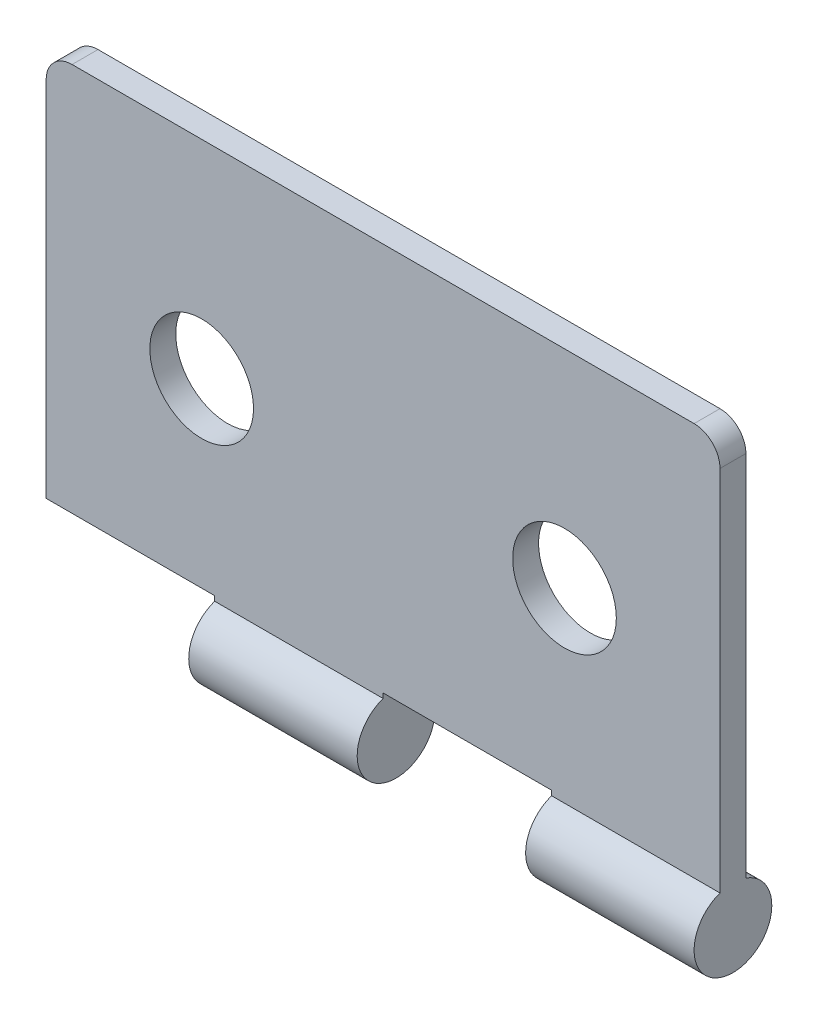
ISO-10303-21;
HEADER;
FILE_DESCRIPTION(('STEP AP214'),'2;1');
FILE_NAME('part.step','',(''),(''),'','','');
FILE_SCHEMA(('AUTOMOTIVE_DESIGN { 1 0 10303 214 1 1 1 1 }'));
ENDSEC;
DATA;
#1=APPLICATION_CONTEXT('core data for automotive mechanical design processes');
#2=APPLICATION_PROTOCOL_DEFINITION('international standard','automotive_design',2000,#1);
#3=PRODUCT_CONTEXT('',#1,'mechanical');
#4=PRODUCT('Part','Part','',(#3));
#5=PRODUCT_RELATED_PRODUCT_CATEGORY('part','',(#4));
#6=PRODUCT_DEFINITION_FORMATION('','',#4);
#7=PRODUCT_DEFINITION_CONTEXT('part definition',#1,'design');
#8=PRODUCT_DEFINITION('design','',#6,#7);
#9=PRODUCT_DEFINITION_SHAPE('','',#8);
#10=(LENGTH_UNIT() NAMED_UNIT(*) SI_UNIT(.MILLI.,.METRE.));
#11=(NAMED_UNIT(*) PLANE_ANGLE_UNIT() SI_UNIT($,.RADIAN.));
#12=(NAMED_UNIT(*) SI_UNIT($,.STERADIAN.) SOLID_ANGLE_UNIT());
#13=UNCERTAINTY_MEASURE_WITH_UNIT(LENGTH_MEASURE(1.E-05),#10,'distance_accuracy_value','');
#14=(GEOMETRIC_REPRESENTATION_CONTEXT(3) GLOBAL_UNCERTAINTY_ASSIGNED_CONTEXT((#13)) GLOBAL_UNIT_ASSIGNED_CONTEXT((#10,
#11,#12)) REPRESENTATION_CONTEXT('',''));
#15=CARTESIAN_POINT('',(0.,0.,0.));
#16=DIRECTION('',(0.,0.,1.));
#17=DIRECTION('',(1.,0.,0.));
#18=AXIS2_PLACEMENT_3D('',#15,#16,#17);
#19=CARTESIAN_POINT('',(30.2426406871193,-1.6,0.5));
#20=DIRECTION('',(-1.,0.,0.));
#21=DIRECTION('',(0.,0.,1.));
#22=AXIS2_PLACEMENT_3D('',#19,#20,#21);
#23=CYLINDRICAL_SURFACE('',#22,1.5);
#24=CARTESIAN_POINT('',(6.5,-1.6,0.5));
#25=DIRECTION('',(1.,0.,0.));
#26=DIRECTION('',(0.,0.,-1.));
#27=AXIS2_PLACEMENT_3D('',#24,#25,#26);
#28=CIRCLE('',#27,1.5);
#29=CARTESIAN_POINT('',(6.5,-0.185786437626905,1.));
#30=VERTEX_POINT('',#29);
#31=CARTESIAN_POINT('',(6.5,-0.185786437626905,0.));
#32=VERTEX_POINT('',#31);
#33=EDGE_CURVE('E45',#30,#32,#28,.T.);
#34=ORIENTED_EDGE('',*,*,#33,.T.);
#35=DIRECTION('',(-1.,0.,0.));
#36=VECTOR('',#35,1.);
#37=CARTESIAN_POINT('',(30.2426406871193,-0.185786437626905,0.));
#38=LINE('',#37,#36);
#39=CARTESIAN_POINT('',(13.,-0.185786437626905,0.));
#40=VERTEX_POINT('',#39);
#41=EDGE_CURVE('E182',#32,#40,#38,.F.);
#42=ORIENTED_EDGE('',*,*,#41,.T.);
#43=CARTESIAN_POINT('',(13.,-1.6,0.5));
#44=DIRECTION('',(-1.,0.,0.));
#45=DIRECTION('',(0.,0.,1.));
#46=AXIS2_PLACEMENT_3D('',#43,#44,#45);
#47=CIRCLE('',#46,1.5);
#48=CARTESIAN_POINT('',(13.,-0.185786437626905,1.));
#49=VERTEX_POINT('',#48);
#50=EDGE_CURVE('E231',#40,#49,#47,.T.);
#51=ORIENTED_EDGE('',*,*,#50,.T.);
#52=DIRECTION('',(-1.,0.,0.));
#53=VECTOR('',#52,1.);
#54=CARTESIAN_POINT('',(30.2426406871193,-0.185786437626905,1.));
#55=LINE('',#54,#53);
#56=EDGE_CURVE('E187',#49,#30,#55,.T.);
#57=ORIENTED_EDGE('',*,*,#56,.T.);
#58=EDGE_LOOP('',(#34,#42,#51,#57));
#59=FACE_BOUND('',#58,.T.);
#60=ADVANCED_FACE('F37',(#59),#23,.T.);
#61=CARTESIAN_POINT('',(0.,0.,1.));
#62=DIRECTION('',(0.,0.,-1.));
#63=DIRECTION('',(-1.,0.,0.));
#64=AXIS2_PLACEMENT_3D('',#61,#62,#63);
#65=PLANE('',#64);
#66=DIRECTION('',(0.,-1.,0.));
#67=VECTOR('',#66,1.);
#68=CARTESIAN_POINT('',(0.,0.,1.));
#69=LINE('',#68,#67);
#70=CARTESIAN_POINT('',(0.,14.,1.));
#71=VERTEX_POINT('',#70);
#72=CARTESIAN_POINT('',(0.,0.,1.));
#73=VERTEX_POINT('',#72);
#74=EDGE_CURVE('E200',#71,#73,#69,.T.);
#75=ORIENTED_EDGE('',*,*,#74,.T.);
#76=DIRECTION('',(1.,0.,0.));
#77=VECTOR('',#76,1.);
#78=CARTESIAN_POINT('',(0.,0.,1.));
#79=LINE('',#78,#77);
#80=CARTESIAN_POINT('',(6.5,0.,1.));
#81=VERTEX_POINT('',#80);
#82=EDGE_CURVE('E173',#73,#81,#79,.T.);
#83=ORIENTED_EDGE('',*,*,#82,.T.);
#84=DIRECTION('',(0.,-1.,0.));
#85=VECTOR('',#84,1.);
#86=CARTESIAN_POINT('',(6.5,0.,1.));
#87=LINE('',#86,#85);
#88=EDGE_CURVE('E168',#81,#30,#87,.T.);
#89=ORIENTED_EDGE('',*,*,#88,.T.);
#90=ORIENTED_EDGE('',*,*,#56,.F.);
#91=DIRECTION('',(0.,1.,0.));
#92=VECTOR('',#91,1.);
#93=CARTESIAN_POINT('',(13.,0.,1.));
#94=LINE('',#93,#92);
#95=CARTESIAN_POINT('',(13.,0.,1.));
#96=VERTEX_POINT('',#95);
#97=EDGE_CURVE('E162',#49,#96,#94,.T.);
#98=ORIENTED_EDGE('',*,*,#97,.T.);
#99=DIRECTION('',(1.,0.,0.));
#100=VECTOR('',#99,1.);
#101=CARTESIAN_POINT('',(0.,0.,1.));
#102=LINE('',#101,#100);
#103=CARTESIAN_POINT('',(19.5,0.,1.));
#104=VERTEX_POINT('',#103);
#105=EDGE_CURVE('E176',#96,#104,#102,.T.);
#106=ORIENTED_EDGE('',*,*,#105,.T.);
#107=DIRECTION('',(0.,-1.,0.));
#108=VECTOR('',#107,1.);
#109=CARTESIAN_POINT('',(19.5,0.,1.));
#110=LINE('',#109,#108);
#111=CARTESIAN_POINT('',(19.5,-0.185786437626905,1.));
#112=VERTEX_POINT('',#111);
#113=EDGE_CURVE('E145',#104,#112,#110,.T.);
#114=ORIENTED_EDGE('',*,*,#113,.T.);
#115=CARTESIAN_POINT('',(26.,-0.185786437626905,1.));
#116=VERTEX_POINT('',#115);
#117=EDGE_CURVE('E183',#116,#112,#55,.T.);
#118=ORIENTED_EDGE('',*,*,#117,.F.);
#119=DIRECTION('',(0.,1.,0.));
#120=VECTOR('',#119,1.);
#121=CARTESIAN_POINT('',(26.,0.,1.));
#122=LINE('',#121,#120);
#123=CARTESIAN_POINT('',(26.,14.,1.));
#124=VERTEX_POINT('',#123);
#125=EDGE_CURVE('E202',#116,#124,#122,.T.);
#126=ORIENTED_EDGE('',*,*,#125,.T.);
#127=CARTESIAN_POINT('',(25.,14.,1.));
#128=DIRECTION('',(0.,0.,-1.));
#129=DIRECTION('',(-1.,0.,0.));
#130=AXIS2_PLACEMENT_3D('',#127,#128,#129);
#131=CIRCLE('',#130,1.);
#132=CARTESIAN_POINT('',(25.,15.,1.));
#133=VERTEX_POINT('',#132);
#134=EDGE_CURVE('E224',#124,#133,#131,.F.);
#135=ORIENTED_EDGE('',*,*,#134,.T.);
#136=DIRECTION('',(-1.,0.,0.));
#137=VECTOR('',#136,1.);
#138=CARTESIAN_POINT('',(0.,15.,1.));
#139=LINE('',#138,#137);
#140=CARTESIAN_POINT('',(1.,15.,1.));
#141=VERTEX_POINT('',#140);
#142=EDGE_CURVE('E205',#133,#141,#139,.T.);
#143=ORIENTED_EDGE('',*,*,#142,.T.);
#144=CARTESIAN_POINT('',(1.,14.,1.));
#145=DIRECTION('',(0.,0.,-1.));
#146=DIRECTION('',(-1.,0.,0.));
#147=AXIS2_PLACEMENT_3D('',#144,#145,#146);
#148=CIRCLE('',#147,1.);
#149=EDGE_CURVE('E52',#141,#71,#148,.F.);
#150=ORIENTED_EDGE('',*,*,#149,.T.);
#151=EDGE_LOOP('',(#75,#83,#89,#90,#98,#106,#114,#118,#126,#135,#143,#150));
#152=FACE_BOUND('',#151,.T.);
#153=CARTESIAN_POINT('',(6.,7.,1.));
#154=DIRECTION('',(0.,0.,1.));
#155=DIRECTION('',(1.,0.,0.));
#156=AXIS2_PLACEMENT_3D('',#153,#154,#155);
#157=CIRCLE('',#156,2.);
#158=CARTESIAN_POINT('',(8.,7.,1.));
#159=VERTEX_POINT('',#158);
#160=EDGE_CURVE('E194',#159,#159,#157,.T.);
#161=ORIENTED_EDGE('',*,*,#160,.F.);
#162=EDGE_LOOP('',(#161));
#163=FACE_BOUND('',#162,.T.);
#164=CARTESIAN_POINT('',(20.,7.,1.));
#165=DIRECTION('',(0.,0.,1.));
#166=DIRECTION('',(1.,0.,0.));
#167=AXIS2_PLACEMENT_3D('',#164,#165,#166);
#168=CIRCLE('',#167,2.);
#169=CARTESIAN_POINT('',(22.,7.,1.));
#170=VERTEX_POINT('',#169);
#171=EDGE_CURVE('E188',#170,#170,#168,.T.);
#172=ORIENTED_EDGE('',*,*,#171,.F.);
#173=EDGE_LOOP('',(#172));
#174=FACE_BOUND('',#173,.T.);
#175=ADVANCED_FACE('F245',(#152,#163,#174),#65,.F.);
#176=CARTESIAN_POINT('',(0.,0.,0.));
#177=DIRECTION('',(0.,0.,-1.));
#178=DIRECTION('',(-1.,0.,0.));
#179=AXIS2_PLACEMENT_3D('',#176,#177,#178);
#180=PLANE('',#179);
#181=DIRECTION('',(1.,0.,0.));
#182=VECTOR('',#181,1.);
#183=CARTESIAN_POINT('',(0.,0.,0.));
#184=LINE('',#183,#182);
#185=CARTESIAN_POINT('',(0.,0.,0.));
#186=VERTEX_POINT('',#185);
#187=CARTESIAN_POINT('',(6.5,0.,0.));
#188=VERTEX_POINT('',#187);
#189=EDGE_CURVE('E171',#186,#188,#184,.T.);
#190=ORIENTED_EDGE('',*,*,#189,.F.);
#191=DIRECTION('',(0.,-1.,0.));
#192=VECTOR('',#191,1.);
#193=CARTESIAN_POINT('',(0.,0.,0.));
#194=LINE('',#193,#192);
#195=CARTESIAN_POINT('',(0.,14.,0.));
#196=VERTEX_POINT('',#195);
#197=EDGE_CURVE('E197',#196,#186,#194,.T.);
#198=ORIENTED_EDGE('',*,*,#197,.F.);
#199=CARTESIAN_POINT('',(1.,14.,0.));
#200=DIRECTION('',(0.,0.,-1.));
#201=DIRECTION('',(-1.,0.,0.));
#202=AXIS2_PLACEMENT_3D('',#199,#200,#201);
#203=CIRCLE('',#202,1.);
#204=CARTESIAN_POINT('',(1.,15.,0.));
#205=VERTEX_POINT('',#204);
#206=EDGE_CURVE('E218',#196,#205,#203,.T.);
#207=ORIENTED_EDGE('',*,*,#206,.T.);
#208=DIRECTION('',(-1.,0.,0.));
#209=VECTOR('',#208,1.);
#210=CARTESIAN_POINT('',(0.,15.,0.));
#211=LINE('',#210,#209);
#212=CARTESIAN_POINT('',(25.,15.,0.));
#213=VERTEX_POINT('',#212);
#214=EDGE_CURVE('E203',#213,#205,#211,.T.);
#215=ORIENTED_EDGE('',*,*,#214,.F.);
#216=CARTESIAN_POINT('',(25.,14.,0.));
#217=DIRECTION('',(0.,0.,-1.));
#218=DIRECTION('',(-1.,0.,0.));
#219=AXIS2_PLACEMENT_3D('',#216,#217,#218);
#220=CIRCLE('',#219,1.);
#221=CARTESIAN_POINT('',(26.,14.,0.));
#222=VERTEX_POINT('',#221);
#223=EDGE_CURVE('E220',#213,#222,#220,.T.);
#224=ORIENTED_EDGE('',*,*,#223,.T.);
#225=DIRECTION('',(0.,1.,0.));
#226=VECTOR('',#225,1.);
#227=CARTESIAN_POINT('',(26.,0.,0.));
#228=LINE('',#227,#226);
#229=CARTESIAN_POINT('',(26.,-0.185786437626905,0.));
#230=VERTEX_POINT('',#229);
#231=EDGE_CURVE('E210',#230,#222,#228,.T.);
#232=ORIENTED_EDGE('',*,*,#231,.F.);
#233=CARTESIAN_POINT('',(19.5,-0.185786437626905,0.));
#234=VERTEX_POINT('',#233);
#235=EDGE_CURVE('E152',#234,#230,#38,.F.);
#236=ORIENTED_EDGE('',*,*,#235,.F.);
#237=DIRECTION('',(0.,-1.,0.));
#238=VECTOR('',#237,1.);
#239=CARTESIAN_POINT('',(19.5,0.,0.));
#240=LINE('',#239,#238);
#241=CARTESIAN_POINT('',(19.5,0.,0.));
#242=VERTEX_POINT('',#241);
#243=EDGE_CURVE('E142',#242,#234,#240,.T.);
#244=ORIENTED_EDGE('',*,*,#243,.F.);
#245=DIRECTION('',(1.,0.,0.));
#246=VECTOR('',#245,1.);
#247=CARTESIAN_POINT('',(0.,0.,0.));
#248=LINE('',#247,#246);
#249=CARTESIAN_POINT('',(13.,0.,0.));
#250=VERTEX_POINT('',#249);
#251=EDGE_CURVE('E11',#250,#242,#248,.T.);
#252=ORIENTED_EDGE('',*,*,#251,.F.);
#253=DIRECTION('',(0.,1.,0.));
#254=VECTOR('',#253,1.);
#255=CARTESIAN_POINT('',(13.,0.,0.));
#256=LINE('',#255,#254);
#257=EDGE_CURVE('E155',#40,#250,#256,.T.);
#258=ORIENTED_EDGE('',*,*,#257,.F.);
#259=ORIENTED_EDGE('',*,*,#41,.F.);
#260=DIRECTION('',(0.,-1.,0.));
#261=VECTOR('',#260,1.);
#262=CARTESIAN_POINT('',(6.5,0.,0.));
#263=LINE('',#262,#261);
#264=EDGE_CURVE('E165',#188,#32,#263,.T.);
#265=ORIENTED_EDGE('',*,*,#264,.F.);
#266=EDGE_LOOP('',(#190,#198,#207,#215,#224,#232,#236,#244,#252,#258,#259,#265));
#267=FACE_BOUND('',#266,.T.);
#268=CARTESIAN_POINT('',(6.,7.,0.));
#269=DIRECTION('',(0.,0.,1.));
#270=DIRECTION('',(1.,0.,0.));
#271=AXIS2_PLACEMENT_3D('',#268,#269,#270);
#272=CIRCLE('',#271,2.);
#273=CARTESIAN_POINT('',(8.,7.,0.));
#274=VERTEX_POINT('',#273);
#275=EDGE_CURVE('E191',#274,#274,#272,.T.);
#276=ORIENTED_EDGE('',*,*,#275,.T.);
#277=EDGE_LOOP('',(#276));
#278=FACE_BOUND('',#277,.T.);
#279=CARTESIAN_POINT('',(20.,7.,0.));
#280=DIRECTION('',(0.,0.,1.));
#281=DIRECTION('',(1.,0.,0.));
#282=AXIS2_PLACEMENT_3D('',#279,#280,#281);
#283=CIRCLE('',#282,2.);
#284=CARTESIAN_POINT('',(22.,7.,0.));
#285=VERTEX_POINT('',#284);
#286=EDGE_CURVE('E186',#285,#285,#283,.T.);
#287=ORIENTED_EDGE('',*,*,#286,.T.);
#288=EDGE_LOOP('',(#287));
#289=FACE_BOUND('',#288,.T.);
#290=ADVANCED_FACE('F149',(#267,#278,#289),#180,.T.);
#291=CARTESIAN_POINT('',(0.,0.,1.));
#292=DIRECTION('',(1.,0.,0.));
#293=DIRECTION('',(0.,0.,-1.));
#294=AXIS2_PLACEMENT_3D('',#291,#292,#293);
#295=PLANE('',#294);
#296=ORIENTED_EDGE('',*,*,#197,.T.);
#297=DIRECTION('',(0.,0.,1.));
#298=VECTOR('',#297,1.);
#299=CARTESIAN_POINT('',(0.,0.,-1.));
#300=LINE('',#299,#298);
#301=EDGE_CURVE('E153',#186,#73,#300,.T.);
#302=ORIENTED_EDGE('',*,*,#301,.T.);
#303=ORIENTED_EDGE('',*,*,#74,.F.);
#304=DIRECTION('',(0.,0.,-1.));
#305=VECTOR('',#304,1.);
#306=CARTESIAN_POINT('',(0.,14.,1.));
#307=LINE('',#306,#305);
#308=EDGE_CURVE('E226',#71,#196,#307,.T.);
#309=ORIENTED_EDGE('',*,*,#308,.T.);
#310=EDGE_LOOP('',(#296,#302,#303,#309));
#311=FACE_BOUND('',#310,.T.);
#312=ADVANCED_FACE('F252',(#311),#295,.F.);
#313=CARTESIAN_POINT('',(26.,0.,1.));
#314=DIRECTION('',(-1.,0.,0.));
#315=DIRECTION('',(0.,0.,1.));
#316=AXIS2_PLACEMENT_3D('',#313,#314,#315);
#317=PLANE('',#316);
#318=ORIENTED_EDGE('',*,*,#231,.T.);
#319=DIRECTION('',(0.,0.,-1.));
#320=VECTOR('',#319,1.);
#321=CARTESIAN_POINT('',(26.,14.,1.));
#322=LINE('',#321,#320);
#323=EDGE_CURVE('E60',#222,#124,#322,.F.);
#324=ORIENTED_EDGE('',*,*,#323,.T.);
#325=ORIENTED_EDGE('',*,*,#125,.F.);
#326=CARTESIAN_POINT('',(26.,-1.6,0.5));
#327=DIRECTION('',(-1.,0.,0.));
#328=DIRECTION('',(0.,0.,1.));
#329=AXIS2_PLACEMENT_3D('',#326,#327,#328);
#330=CIRCLE('',#329,1.5);
#331=EDGE_CURVE('E178',#230,#116,#330,.T.);
#332=ORIENTED_EDGE('',*,*,#331,.F.);
#333=EDGE_LOOP('',(#318,#324,#325,#332));
#334=FACE_BOUND('',#333,.T.);
#335=ADVANCED_FACE('F265',(#334),#317,.F.);
#336=CARTESIAN_POINT('',(0.,15.,1.));
#337=DIRECTION('',(0.,-1.,0.));
#338=DIRECTION('',(0.,0.,-1.));
#339=AXIS2_PLACEMENT_3D('',#336,#337,#338);
#340=PLANE('',#339);
#341=ORIENTED_EDGE('',*,*,#142,.F.);
#342=DIRECTION('',(0.,0.,-1.));
#343=VECTOR('',#342,1.);
#344=CARTESIAN_POINT('',(25.,15.,1.));
#345=LINE('',#344,#343);
#346=EDGE_CURVE('E215',#133,#213,#345,.T.);
#347=ORIENTED_EDGE('',*,*,#346,.T.);
#348=ORIENTED_EDGE('',*,*,#214,.T.);
#349=DIRECTION('',(0.,0.,-1.));
#350=VECTOR('',#349,1.);
#351=CARTESIAN_POINT('',(1.,15.,1.));
#352=LINE('',#351,#350);
#353=EDGE_CURVE('E207',#205,#141,#352,.F.);
#354=ORIENTED_EDGE('',*,*,#353,.T.);
#355=EDGE_LOOP('',(#341,#347,#348,#354));
#356=FACE_BOUND('',#355,.T.);
#357=ADVANCED_FACE('F259',(#356),#340,.F.);
#358=CARTESIAN_POINT('',(6.,7.,1.));
#359=DIRECTION('',(0.,0.,-1.));
#360=DIRECTION('',(-1.,0.,0.));
#361=AXIS2_PLACEMENT_3D('',#358,#359,#360);
#362=CYLINDRICAL_SURFACE('',#361,2.);
#363=ORIENTED_EDGE('',*,*,#160,.T.);
#364=EDGE_LOOP('',(#363));
#365=FACE_BOUND('',#364,.T.);
#366=ORIENTED_EDGE('',*,*,#275,.F.);
#367=EDGE_LOOP('',(#366));
#368=FACE_BOUND('',#367,.T.);
#369=ADVANCED_FACE('F286',(#365,#368),#362,.F.);
#370=CARTESIAN_POINT('',(20.,7.,1.));
#371=DIRECTION('',(0.,0.,-1.));
#372=DIRECTION('',(-1.,0.,0.));
#373=AXIS2_PLACEMENT_3D('',#370,#371,#372);
#374=CYLINDRICAL_SURFACE('',#373,2.);
#375=ORIENTED_EDGE('',*,*,#171,.T.);
#376=EDGE_LOOP('',(#375));
#377=FACE_BOUND('',#376,.T.);
#378=ORIENTED_EDGE('',*,*,#286,.F.);
#379=EDGE_LOOP('',(#378));
#380=FACE_BOUND('',#379,.T.);
#381=ADVANCED_FACE('F294',(#377,#380),#374,.F.);
#382=CARTESIAN_POINT('',(25.,14.,1.));
#383=DIRECTION('',(0.,0.,-1.));
#384=DIRECTION('',(-1.,0.,0.));
#385=AXIS2_PLACEMENT_3D('',#382,#383,#384);
#386=CYLINDRICAL_SURFACE('',#385,1.);
#387=ORIENTED_EDGE('',*,*,#134,.F.);
#388=ORIENTED_EDGE('',*,*,#323,.F.);
#389=ORIENTED_EDGE('',*,*,#223,.F.);
#390=ORIENTED_EDGE('',*,*,#346,.F.);
#391=EDGE_LOOP('',(#387,#388,#389,#390));
#392=FACE_BOUND('',#391,.T.);
#393=ADVANCED_FACE('F263',(#392),#386,.T.);
#394=CARTESIAN_POINT('',(1.,14.,1.));
#395=DIRECTION('',(0.,0.,-1.));
#396=DIRECTION('',(-1.,0.,0.));
#397=AXIS2_PLACEMENT_3D('',#394,#395,#396);
#398=CYLINDRICAL_SURFACE('',#397,1.);
#399=ORIENTED_EDGE('',*,*,#149,.F.);
#400=ORIENTED_EDGE('',*,*,#353,.F.);
#401=ORIENTED_EDGE('',*,*,#206,.F.);
#402=ORIENTED_EDGE('',*,*,#308,.F.);
#403=EDGE_LOOP('',(#399,#400,#401,#402));
#404=FACE_BOUND('',#403,.T.);
#405=ADVANCED_FACE('F39',(#404),#398,.T.);
#406=CARTESIAN_POINT('',(19.5,-1.6,0.5));
#407=DIRECTION('',(1.,0.,0.));
#408=DIRECTION('',(0.,0.,-1.));
#409=AXIS2_PLACEMENT_3D('',#406,#407,#408);
#410=CIRCLE('',#409,1.5);
#411=EDGE_CURVE('E229',#112,#234,#410,.T.);
#412=ORIENTED_EDGE('',*,*,#411,.T.);
#413=ORIENTED_EDGE('',*,*,#235,.T.);
#414=ORIENTED_EDGE('',*,*,#331,.T.);
#415=ORIENTED_EDGE('',*,*,#117,.T.);
#416=EDGE_LOOP('',(#412,#413,#414,#415));
#417=FACE_BOUND('',#416,.T.);
#418=ADVANCED_FACE('F267',(#417),#23,.T.);
#419=CARTESIAN_POINT('',(13.,0.,-1.));
#420=DIRECTION('',(0.,1.,0.));
#421=DIRECTION('',(0.,0.,1.));
#422=AXIS2_PLACEMENT_3D('',#419,#420,#421);
#423=PLANE('',#422);
#424=DIRECTION('',(0.,0.,1.));
#425=VECTOR('',#424,1.);
#426=CARTESIAN_POINT('',(13.,0.,-1.));
#427=LINE('',#426,#425);
#428=EDGE_CURVE('E135',#250,#96,#427,.T.);
#429=ORIENTED_EDGE('',*,*,#428,.F.);
#430=ORIENTED_EDGE('',*,*,#251,.T.);
#431=DIRECTION('',(0.,0.,1.));
#432=VECTOR('',#431,1.);
#433=CARTESIAN_POINT('',(19.5,0.,-1.));
#434=LINE('',#433,#432);
#435=EDGE_CURVE('E132',#242,#104,#434,.T.);
#436=ORIENTED_EDGE('',*,*,#435,.T.);
#437=ORIENTED_EDGE('',*,*,#105,.F.);
#438=EDGE_LOOP('',(#429,#430,#436,#437));
#439=FACE_BOUND('',#438,.T.);
#440=ADVANCED_FACE('F131',(#439),#423,.F.);
#441=CARTESIAN_POINT('',(13.,0.,-1.));
#442=DIRECTION('',(-1.,0.,0.));
#443=DIRECTION('',(0.,0.,1.));
#444=AXIS2_PLACEMENT_3D('',#441,#442,#443);
#445=PLANE('',#444);
#446=ORIENTED_EDGE('',*,*,#97,.F.);
#447=ORIENTED_EDGE('',*,*,#50,.F.);
#448=ORIENTED_EDGE('',*,*,#257,.T.);
#449=ORIENTED_EDGE('',*,*,#428,.T.);
#450=EDGE_LOOP('',(#446,#447,#448,#449));
#451=FACE_BOUND('',#450,.T.);
#452=ADVANCED_FACE('F244',(#451),#445,.F.);
#453=CARTESIAN_POINT('',(19.5,0.,-1.));
#454=DIRECTION('',(1.,0.,0.));
#455=DIRECTION('',(0.,0.,-1.));
#456=AXIS2_PLACEMENT_3D('',#453,#454,#455);
#457=PLANE('',#456);
#458=ORIENTED_EDGE('',*,*,#435,.F.);
#459=ORIENTED_EDGE('',*,*,#243,.T.);
#460=ORIENTED_EDGE('',*,*,#411,.F.);
#461=ORIENTED_EDGE('',*,*,#113,.F.);
#462=EDGE_LOOP('',(#458,#459,#460,#461));
#463=FACE_BOUND('',#462,.T.);
#464=ADVANCED_FACE('F141',(#463),#457,.F.);
#465=CARTESIAN_POINT('',(0.,0.,-1.));
#466=DIRECTION('',(0.,1.,0.));
#467=DIRECTION('',(0.,0.,1.));
#468=AXIS2_PLACEMENT_3D('',#465,#466,#467);
#469=PLANE('',#468);
#470=ORIENTED_EDGE('',*,*,#301,.F.);
#471=ORIENTED_EDGE('',*,*,#189,.T.);
#472=DIRECTION('',(0.,0.,1.));
#473=VECTOR('',#472,1.);
#474=CARTESIAN_POINT('',(6.5,0.,-1.));
#475=LINE('',#474,#473);
#476=EDGE_CURVE('E146',#188,#81,#475,.T.);
#477=ORIENTED_EDGE('',*,*,#476,.T.);
#478=ORIENTED_EDGE('',*,*,#82,.F.);
#479=EDGE_LOOP('',(#470,#471,#477,#478));
#480=FACE_BOUND('',#479,.T.);
#481=ADVANCED_FACE('F248',(#480),#469,.F.);
#482=CARTESIAN_POINT('',(6.5,0.,-1.));
#483=DIRECTION('',(1.,0.,0.));
#484=DIRECTION('',(0.,0.,-1.));
#485=AXIS2_PLACEMENT_3D('',#482,#483,#484);
#486=PLANE('',#485);
#487=ORIENTED_EDGE('',*,*,#476,.F.);
#488=ORIENTED_EDGE('',*,*,#264,.T.);
#489=ORIENTED_EDGE('',*,*,#33,.F.);
#490=ORIENTED_EDGE('',*,*,#88,.F.);
#491=EDGE_LOOP('',(#487,#488,#489,#490));
#492=FACE_BOUND('',#491,.T.);
#493=ADVANCED_FACE('F240',(#492),#486,.F.);
#494=CLOSED_SHELL('',(#60,#175,#290,#312,#335,#357,#369,#381,#393,#405,#418,#440,#452,#464,#481,#493));
#495=MANIFOLD_SOLID_BREP('B2',#494);
#496=ADVANCED_BREP_SHAPE_REPRESENTATION('',(#18,#495),#14);
#497=SHAPE_DEFINITION_REPRESENTATION(#9,#496);
ENDSEC;
END-ISO-10303-21;
